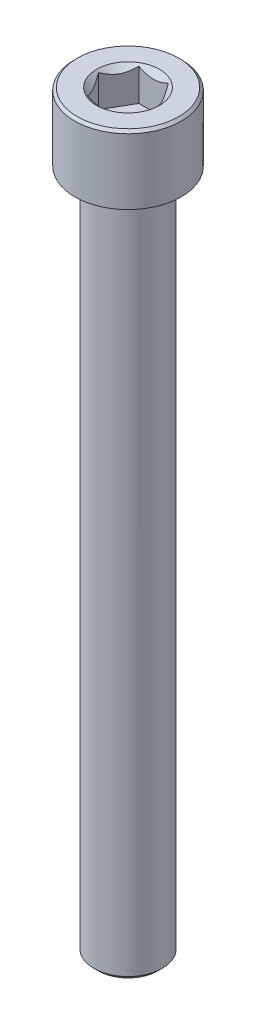
ISO-10303-21;
HEADER;
FILE_DESCRIPTION(('STEP AP214'),'2;1');
FILE_NAME('part.step','',(''),(''),'','','');
FILE_SCHEMA(('AUTOMOTIVE_DESIGN { 1 0 10303 214 1 1 1 1 }'));
ENDSEC;
DATA;
#1=APPLICATION_CONTEXT('core data for automotive mechanical design processes');
#2=APPLICATION_PROTOCOL_DEFINITION('international standard','automotive_design',2000,#1);
#3=PRODUCT_CONTEXT('',#1,'mechanical');
#4=PRODUCT('Part','Part','',(#3));
#5=PRODUCT_RELATED_PRODUCT_CATEGORY('part','',(#4));
#6=PRODUCT_DEFINITION_FORMATION('','',#4);
#7=PRODUCT_DEFINITION_CONTEXT('part definition',#1,'design');
#8=PRODUCT_DEFINITION('design','',#6,#7);
#9=PRODUCT_DEFINITION_SHAPE('','',#8);
#10=(LENGTH_UNIT() NAMED_UNIT(*) SI_UNIT(.MILLI.,.METRE.));
#11=(NAMED_UNIT(*) PLANE_ANGLE_UNIT() SI_UNIT($,.RADIAN.));
#12=(NAMED_UNIT(*) SI_UNIT($,.STERADIAN.) SOLID_ANGLE_UNIT());
#13=UNCERTAINTY_MEASURE_WITH_UNIT(LENGTH_MEASURE(1.E-05),#10,'distance_accuracy_value','');
#14=(GEOMETRIC_REPRESENTATION_CONTEXT(3) GLOBAL_UNCERTAINTY_ASSIGNED_CONTEXT((#13)) GLOBAL_UNIT_ASSIGNED_CONTEXT((#10,
#11,#12)) REPRESENTATION_CONTEXT('',''));
#15=CARTESIAN_POINT('',(0.,0.,0.));
#16=DIRECTION('',(0.,0.,1.));
#17=DIRECTION('',(1.,0.,0.));
#18=AXIS2_PLACEMENT_3D('',#15,#16,#17);
#19=CARTESIAN_POINT('',(0.,0.,0.));
#20=DIRECTION('',(0.,1.,0.));
#21=DIRECTION('',(0.,0.,1.));
#22=AXIS2_PLACEMENT_3D('',#19,#20,#21);
#23=PLANE('',#22);
#24=CARTESIAN_POINT('',(0.,0.,0.));
#25=DIRECTION('',(0.,1.,0.));
#26=DIRECTION('',(0.,0.,1.));
#27=AXIS2_PLACEMENT_3D('',#24,#25,#26);
#28=CIRCLE('',#27,3.5);
#29=CARTESIAN_POINT('',(0.,0.,3.5));
#30=VERTEX_POINT('',#29);
#31=EDGE_CURVE('E43',#30,#30,#28,.F.);
#32=ORIENTED_EDGE('',*,*,#31,.T.);
#33=EDGE_LOOP('',(#32));
#34=FACE_BOUND('',#33,.T.);
#35=ADVANCED_FACE('F35',(#34),#23,.F.);
#36=CARTESIAN_POINT('',(0.,0.,0.));
#37=DIRECTION('',(0.,-1.,0.));
#38=DIRECTION('',(0.,0.,-1.));
#39=AXIS2_PLACEMENT_3D('',#36,#37,#38);
#40=CYLINDRICAL_SURFACE('',#39,4.);
#41=CARTESIAN_POINT('',(0.,0.499999999999997,0.));
#42=DIRECTION('',(0.,1.,0.));
#43=DIRECTION('',(0.,0.,1.));
#44=AXIS2_PLACEMENT_3D('',#41,#42,#43);
#45=CIRCLE('',#44,4.);
#46=CARTESIAN_POINT('',(0.,0.499999999999997,4.));
#47=VERTEX_POINT('',#46);
#48=EDGE_CURVE('E11',#47,#47,#45,.T.);
#49=ORIENTED_EDGE('',*,*,#48,.T.);
#50=EDGE_LOOP('',(#49));
#51=FACE_BOUND('',#50,.T.);
#52=CARTESIAN_POINT('',(0.,80.,0.));
#53=DIRECTION('',(0.,-1.,0.));
#54=DIRECTION('',(0.,0.,-1.));
#55=AXIS2_PLACEMENT_3D('',#52,#53,#54);
#56=CIRCLE('',#55,4.);
#57=CARTESIAN_POINT('',(0.,80.,-4.));
#58=VERTEX_POINT('',#57);
#59=EDGE_CURVE('E120',#58,#58,#56,.T.);
#60=ORIENTED_EDGE('',*,*,#59,.T.);
#61=EDGE_LOOP('',(#60));
#62=FACE_BOUND('',#61,.T.);
#63=ADVANCED_FACE('F191',(#51,#62),#40,.T.);
#64=CARTESIAN_POINT('',(-4.,80.,0.));
#65=DIRECTION('',(0.,1.,0.));
#66=DIRECTION('',(0.,0.,1.));
#67=AXIS2_PLACEMENT_3D('',#64,#65,#66);
#68=PLANE('',#67);
#69=ORIENTED_EDGE('',*,*,#59,.F.);
#70=EDGE_LOOP('',(#69));
#71=FACE_BOUND('',#70,.T.);
#72=CARTESIAN_POINT('',(0.,80.,0.));
#73=DIRECTION('',(0.,-1.,0.));
#74=DIRECTION('',(0.,0.,-1.));
#75=AXIS2_PLACEMENT_3D('',#72,#73,#74);
#76=CIRCLE('',#75,6.25);
#77=CARTESIAN_POINT('',(0.,80.,-6.25));
#78=VERTEX_POINT('',#77);
#79=EDGE_CURVE('E117',#78,#78,#76,.T.);
#80=ORIENTED_EDGE('',*,*,#79,.T.);
#81=EDGE_LOOP('',(#80));
#82=FACE_BOUND('',#81,.T.);
#83=ADVANCED_FACE('F197',(#71,#82),#68,.F.);
#84=CARTESIAN_POINT('',(0.,0.,0.));
#85=DIRECTION('',(0.,-1.,0.));
#86=DIRECTION('',(0.,0.,-1.));
#87=AXIS2_PLACEMENT_3D('',#84,#85,#86);
#88=CYLINDRICAL_SURFACE('',#87,6.25);
#89=CARTESIAN_POINT('',(0.,87.7,0.));
#90=DIRECTION('',(0.,-1.,0.));
#91=DIRECTION('',(0.,0.,-1.));
#92=AXIS2_PLACEMENT_3D('',#89,#90,#91);
#93=CIRCLE('',#92,6.25);
#94=CARTESIAN_POINT('',(0.,87.7,-6.25));
#95=VERTEX_POINT('',#94);
#96=EDGE_CURVE('E123',#95,#95,#93,.T.);
#97=ORIENTED_EDGE('',*,*,#96,.T.);
#98=EDGE_LOOP('',(#97));
#99=FACE_BOUND('',#98,.T.);
#100=ORIENTED_EDGE('',*,*,#79,.F.);
#101=EDGE_LOOP('',(#100));
#102=FACE_BOUND('',#101,.T.);
#103=ADVANCED_FACE('F208',(#99,#102),#88,.T.);
#104=CARTESIAN_POINT('',(-6.25,88.,0.));
#105=DIRECTION('',(0.,-1.,0.));
#106=DIRECTION('',(0.,0.,-1.));
#107=AXIS2_PLACEMENT_3D('',#104,#105,#106);
#108=PLANE('',#107);
#109=CARTESIAN_POINT('',(0.,88.,0.));
#110=DIRECTION('',(0.,1.,0.));
#111=DIRECTION('',(0.,0.,1.));
#112=AXIS2_PLACEMENT_3D('',#109,#110,#111);
#113=CIRCLE('',#112,3.68172134015619);
#114=CARTESIAN_POINT('',(0.,88.,3.68172134015619));
#115=VERTEX_POINT('',#114);
#116=EDGE_CURVE('E338',#115,#115,#113,.T.);
#117=ORIENTED_EDGE('',*,*,#116,.F.);
#118=EDGE_LOOP('',(#117));
#119=FACE_BOUND('',#118,.T.);
#120=CARTESIAN_POINT('',(0.,88.,0.));
#121=DIRECTION('',(0.,-1.,0.));
#122=DIRECTION('',(0.,0.,-1.));
#123=AXIS2_PLACEMENT_3D('',#120,#121,#122);
#124=CIRCLE('',#123,5.95000000000002);
#125=CARTESIAN_POINT('',(0.,88.,-5.95000000000002));
#126=VERTEX_POINT('',#125);
#127=EDGE_CURVE('E94',#126,#126,#124,.F.);
#128=ORIENTED_EDGE('',*,*,#127,.T.);
#129=EDGE_LOOP('',(#128));
#130=FACE_BOUND('',#129,.T.);
#131=ADVANCED_FACE('F203',(#119,#130),#108,.F.);
#132=CARTESIAN_POINT('',(0.,87.7,0.));
#133=DIRECTION('',(0.,-1.,0.));
#134=DIRECTION('',(0.,0.,-1.));
#135=AXIS2_PLACEMENT_3D('',#132,#133,#134);
#136=CONICAL_SURFACE('',#135,6.25,0.785398163397451);
#137=ORIENTED_EDGE('',*,*,#127,.F.);
#138=EDGE_LOOP('',(#137));
#139=FACE_BOUND('',#138,.T.);
#140=ORIENTED_EDGE('',*,*,#96,.F.);
#141=EDGE_LOOP('',(#140));
#142=FACE_BOUND('',#141,.T.);
#143=ADVANCED_FACE('F139',(#139,#142),#136,.T.);
#144=CARTESIAN_POINT('',(0.,88.,0.));
#145=DIRECTION('',(0.,1.,0.));
#146=DIRECTION('',(0.,0.,1.));
#147=AXIS2_PLACEMENT_3D('',#144,#145,#146);
#148=CONICAL_SURFACE('',#147,3.68172134015619,0.785398163397449);
#149=ORIENTED_EDGE('',*,*,#116,.T.);
#150=EDGE_LOOP('',(#149));
#151=FACE_BOUND('',#150,.T.);
#152=CARTESIAN_POINT('',(-3.57414153717217,88.9845928078346,3.));
#153=CARTESIAN_POINT('',(-3.48763354421077,88.918347344031,3.));
#154=CARTESIAN_POINT('',(-3.40065485701271,88.8527068014046,3.));
#155=CARTESIAN_POINT('',(-3.22556536628367,88.7229105596247,3.));
#156=CARTESIAN_POINT('',(-3.13745429592208,88.6587552207989,3.));
#157=CARTESIAN_POINT('',(-2.95926502940819,88.5317477625692,3.));
#158=CARTESIAN_POINT('',(-2.86917689491204,88.4689095404859,3.));
#159=CARTESIAN_POINT('',(-2.68749351951163,88.3454583721269,3.));
#160=CARTESIAN_POINT('',(-2.5958983836401,88.2848452717117,3.));
#161=CARTESIAN_POINT('',(-2.40523426187287,88.1626856152111,3.));
#162=CARTESIAN_POINT('',(-2.30605328102177,88.1013129786067,3.));
#163=CARTESIAN_POINT('',(-2.105365061048,87.9824325210317,3.));
#164=CARTESIAN_POINT('',(-2.00385743987677,87.9249253409785,3.));
#165=CARTESIAN_POINT('',(-1.79849745550954,87.8150046063731,3.));
#166=CARTESIAN_POINT('',(-1.69465316441121,87.7625760890662,3.));
#167=CARTESIAN_POINT('',(-1.48405420683512,87.663987161909,3.));
#168=CARTESIAN_POINT('',(-1.37730092797841,87.6178238242345,3.));
#169=CARTESIAN_POINT('',(-1.17088222190216,87.5374103113695,3.));
#170=CARTESIAN_POINT('',(-1.07149734601239,87.5024473221765,3.));
#171=CARTESIAN_POINT('',(-0.870230144552076,87.4404802404136,3.));
#172=CARTESIAN_POINT('',(-0.768347657354247,87.4134766643998,3.));
#173=CARTESIAN_POINT('',(-0.564447624779061,87.3693266023403,3.));
#174=CARTESIAN_POINT('',(-0.462468933304163,87.3520036676269,3.));
#175=CARTESIAN_POINT('',(-0.257288650084501,87.3275703633682,3.));
#176=CARTESIAN_POINT('',(-0.154087304614485,87.3204579712627,3.));
#177=CARTESIAN_POINT('',(0.0481861337271449,87.3170323431804,3.));
#178=CARTESIAN_POINT('',(0.147250905244539,87.3202810238262,3.));
#179=CARTESIAN_POINT('',(0.344589076655326,87.3364014246806,3.));
#180=CARTESIAN_POINT('',(0.44286240247697,87.3492740352571,3.));
#181=CARTESIAN_POINT('',(0.639570667541516,87.3841396910622,3.));
#182=CARTESIAN_POINT('',(0.737976852204939,87.4062922789742,3.));
#183=CARTESIAN_POINT('',(0.932628435913935,87.4585009084323,3.));
#184=CARTESIAN_POINT('',(1.02887397223985,87.4885564463,3.));
#185=CARTESIAN_POINT('',(1.22532003458177,87.5574747225556,3.));
#186=CARTESIAN_POINT('',(1.32536043310459,87.5967888675383,3.));
#187=CARTESIAN_POINT('',(1.52284952412821,87.6814775662887,3.));
#188=CARTESIAN_POINT('',(1.62029736425405,87.7268540844093,3.));
#189=CARTESIAN_POINT('',(1.81308604298931,87.8225985437204,3.));
#190=CARTESIAN_POINT('',(1.90841896877327,87.8729822890255,3.));
#191=CARTESIAN_POINT('',(2.09689622819787,87.9776272778976,3.));
#192=CARTESIAN_POINT('',(2.19004094502825,88.031887835746,3.));
#193=CARTESIAN_POINT('',(2.369872611791,88.1407691556288,3.));
#194=CARTESIAN_POINT('',(2.45665114613525,88.1952394529636,3.));
#195=CARTESIAN_POINT('',(2.62871750489488,88.3064926464856,3.));
#196=CARTESIAN_POINT('',(2.71400521657294,88.3632757164947,3.));
#197=CARTESIAN_POINT('',(2.88259790064296,88.4782780272199,3.));
#198=CARTESIAN_POINT('',(2.96591330750259,88.5364820260229,3.));
#199=CARTESIAN_POINT('',(3.13140205426232,88.6544457904063,3.));
#200=CARTESIAN_POINT('',(3.21357570254097,88.7142051228644,3.));
#201=CARTESIAN_POINT('',(3.2952705817368,88.7746009335197,3.));
#202=B_SPLINE_CURVE_WITH_KNOTS('',3,(#152,#153,#154,#155,#156,#157,#158,#159,#160,#161,#162,
#163,#164,#165,#166,#167,#168,#169,#170,#171,#172,#173,#174,#175,#176,#177,#178,#179,#180,#181,
#182,#183,#184,#185,#186,#187,#188,#189,#190,#191,#192,#193,#194,#195,#196,#197,#198,#199,#200,
#201),.UNSPECIFIED.,.F.,.F.,(4,2,2,2,2,2,2,2,2,2,2,2,2,2,2,2,2,2,2,2,2,2,2,2,4),(0.,
0.326883534696343,0.653845561216819,0.983333574679485,1.31279872045119,1.66263039077582,
2.012519923068,2.36134508374108,2.71000666706381,3.02579926641578,3.34161235580212,
3.65146388205708,3.96125402275307,4.25812208285705,4.55501761141501,4.85724167639796,
5.15944648441816,5.48166266665303,5.80398350895796,6.12735610013868,6.45067163510516,
6.75800096012909,7.0653534259893,7.37023156667129,7.67502569597),.UNSPECIFIED.);
#203=CARTESIAN_POINT('',(-1.73205080756888,87.7823802749816,3.));
#204=VERTEX_POINT('',#203);
#205=CARTESIAN_POINT('',(1.73205080756888,87.7823802749816,3.));
#206=VERTEX_POINT('',#205);
#207=EDGE_CURVE('E101',#204,#206,#202,.T.);
#208=ORIENTED_EDGE('',*,*,#207,.F.);
#209=CARTESIAN_POINT('',(-3.46421708519159,87.7824957508087,-0.000199999999999535));
#210=CARTESIAN_POINT('',(-3.40467869607211,87.7230085933033,0.102923514955744));
#211=CARTESIAN_POINT('',(-3.34414474757781,87.6670152544471,0.207771389330644));
#212=CARTESIAN_POINT('',(-3.2207094063533,87.5644928713605,0.421567671781089));
#213=CARTESIAN_POINT('',(-3.15779627521276,87.5180208687229,0.530536411379754));
#214=CARTESIAN_POINT('',(-3.03093496880242,87.4384134634979,0.750266639597022));
#215=CARTESIAN_POINT('',(-2.96701910000607,87.4050779756242,0.860972171762204));
#216=CARTESIAN_POINT('',(-2.83778025907547,87.3537178189609,1.08482041056532));
#217=CARTESIAN_POINT('',(-2.7724612348602,87.3356548125172,1.19795627920698));
#218=CARTESIAN_POINT('',(-2.65988677911465,87.3193571834321,1.39294095619269));
#219=CARTESIAN_POINT('',(-2.61277673046431,87.3169446421554,1.47453795400212));
#220=CARTESIAN_POINT('',(-2.51863325954799,87.3210097096387,1.63759922883008));
#221=CARTESIAN_POINT('',(-2.47159986993094,87.3274904350099,1.71906344929898));
#222=CARTESIAN_POINT('',(-2.37797867687426,87.3489719974968,1.88122011233836));
#223=CARTESIAN_POINT('',(-2.3313914312269,87.3639823649488,1.96191158878429));
#224=CARTESIAN_POINT('',(-2.23901705721439,87.4017039210476,2.12190869789132));
#225=CARTESIAN_POINT('',(-2.1932298677905,87.4244145193044,2.20121443630928));
#226=CARTESIAN_POINT('',(-2.11194373930153,87.4711409598355,2.34200614080274));
#227=CARTESIAN_POINT('',(-2.07626488907773,87.4939286026624,2.40380372214602));
#228=CARTESIAN_POINT('',(-2.00554773988156,87.543176561039,2.52628941752021));
#229=CARTESIAN_POINT('',(-1.97050946049034,87.5696369886478,2.5869774976356));
#230=CARTESIAN_POINT('',(-1.90118383838356,87.6256372693729,2.70705299739086));
#231=CARTESIAN_POINT('',(-1.86689452386373,87.6551674394599,2.76644383229591));
#232=CARTESIAN_POINT('',(-1.79895094584795,87.7169193665571,2.88412556146727));
#233=CARTESIAN_POINT('',(-1.76529630793217,87.7491394716409,2.94241710424774));
#234=CARTESIAN_POINT('',(-1.73193533751504,87.7824957508087,3.0002));
#235=B_SPLINE_CURVE_WITH_KNOTS('',3,(#209,#210,#211,#212,#213,#214,#215,#216,#217,#218,#219,
#220,#221,#222,#223,#224,#225,#226,#227,#228,#229,#230,#231,#232,#233,#234),.UNSPECIFIED.,.F.,
.F.,(4,2,2,2,2,2,2,2,2,2,2,2,4),(0.,0.399603557139297,0.801535286397833,1.19708369162342,
1.59163620080172,1.87398941755843,2.15644160919091,2.43921001247423,2.72195674032136,
2.94657516661926,3.17120044767274,3.39513752837809,3.61893808380739),.UNSPECIFIED.);
#236=CARTESIAN_POINT('',(-3.46410161513775,87.7823802749816,0.));
#237=VERTEX_POINT('',#236);
#238=EDGE_CURVE('E159',#237,#204,#235,.T.);
#239=ORIENTED_EDGE('',*,*,#238,.F.);
#240=CARTESIAN_POINT('',(-1.73193533751504,87.7824957508087,-3.0002));
#241=CARTESIAN_POINT('',(-1.79147372663452,87.7230085933034,-2.89707648504425));
#242=CARTESIAN_POINT('',(-1.85200767512883,87.6670152544471,-2.79222861066935));
#243=CARTESIAN_POINT('',(-1.97544301635334,87.5644928713605,-2.5784323282189));
#244=CARTESIAN_POINT('',(-2.03835614749388,87.5180208687228,-2.46946358862024));
#245=CARTESIAN_POINT('',(-2.16521745390422,87.4384134634979,-2.24973336040297));
#246=CARTESIAN_POINT('',(-2.22913332270057,87.4050779756242,-2.13902782823779));
#247=CARTESIAN_POINT('',(-2.35837216363117,87.3537178189609,-1.91517958943468));
#248=CARTESIAN_POINT('',(-2.42369118784644,87.3356548125172,-1.80204372079301));
#249=CARTESIAN_POINT('',(-2.53626564359199,87.3193571834321,-1.6070590438073));
#250=CARTESIAN_POINT('',(-2.58337569224233,87.3169446421554,-1.52546204599787));
#251=CARTESIAN_POINT('',(-2.67751916315865,87.3210097096387,-1.36240077116991));
#252=CARTESIAN_POINT('',(-2.72455255277569,87.3274904350099,-1.28093655070102));
#253=CARTESIAN_POINT('',(-2.81817374583237,87.3489719974968,-1.11877988766163));
#254=CARTESIAN_POINT('',(-2.86476099147974,87.3639823649488,-1.0380884112157));
#255=CARTESIAN_POINT('',(-2.95713536549225,87.4017039210476,-0.87809130210867));
#256=CARTESIAN_POINT('',(-3.00292255491614,87.4244145193044,-0.798785563690709));
#257=CARTESIAN_POINT('',(-3.0842086834051,87.4711409598355,-0.657993859197251));
#258=CARTESIAN_POINT('',(-3.11988753362891,87.4939286026624,-0.596196277853977));
#259=CARTESIAN_POINT('',(-3.19060468282508,87.543176561039,-0.473710582479782));
#260=CARTESIAN_POINT('',(-3.2256429622163,87.5696369886478,-0.413022502364399));
#261=CARTESIAN_POINT('',(-3.29496858432307,87.6256372693729,-0.29294700260914));
#262=CARTESIAN_POINT('',(-3.32925789884291,87.6551674394599,-0.233556167704084));
#263=CARTESIAN_POINT('',(-3.39720147685869,87.7169193665571,-0.115874438532732));
#264=CARTESIAN_POINT('',(-3.43085611477447,87.7491394716409,-0.0575828957522648));
#265=CARTESIAN_POINT('',(-3.46421708519159,87.7824957508087,0.000199999999999888));
#266=B_SPLINE_CURVE_WITH_KNOTS('',3,(#240,#241,#242,#243,#244,#245,#246,#247,#248,#249,#250,
#251,#252,#253,#254,#255,#256,#257,#258,#259,#260,#261,#262,#263,#264,#265),.UNSPECIFIED.,.F.,
.F.,(4,2,2,2,2,2,2,2,2,2,2,2,4),(0.,0.399603557139306,0.801535286397845,1.19708369162343,
1.59163620080172,1.87398941755844,2.15644160919092,2.43921001247424,2.72195674032137,
2.94657516661926,3.17120044767274,3.39513752837809,3.61893808380739),.UNSPECIFIED.);
#267=CARTESIAN_POINT('',(-1.73205080756888,87.7823802749816,-3.));
#268=VERTEX_POINT('',#267);
#269=EDGE_CURVE('E153',#268,#237,#266,.T.);
#270=ORIENTED_EDGE('',*,*,#269,.F.);
#271=CARTESIAN_POINT('',(-3.57414153716177,88.9845928078267,-3.));
#272=CARTESIAN_POINT('',(-3.48763354420066,88.9183473440233,-3.));
#273=CARTESIAN_POINT('',(-3.4006548570029,88.8527068013973,-3.));
#274=CARTESIAN_POINT('',(-3.22556536627446,88.7229105596179,-3.));
#275=CARTESIAN_POINT('',(-3.13745429591317,88.6587552207925,-3.));
#276=CARTESIAN_POINT('',(-2.95926502939989,88.5317477625634,-3.));
#277=CARTESIAN_POINT('',(-2.86917689490405,88.4689095404803,-3.));
#278=CARTESIAN_POINT('',(-2.68749351950428,88.345458372122,-3.));
#279=CARTESIAN_POINT('',(-2.59589838363306,88.2848452717071,-3.));
#280=CARTESIAN_POINT('',(-2.40523426186653,88.1626856152071,-3.));
#281=CARTESIAN_POINT('',(-2.3060532810158,88.101312978603,-3.));
#282=CARTESIAN_POINT('',(-2.10536506104278,87.9824325210287,-3.));
#283=CARTESIAN_POINT('',(-2.00385743987193,87.9249253409758,-3.));
#284=CARTESIAN_POINT('',(-1.79849745550547,87.815004606371,-3.));
#285=CARTESIAN_POINT('',(-1.69465316440754,87.7625760890644,-3.));
#286=CARTESIAN_POINT('',(-1.48405420683225,87.6639871619078,-3.));
#287=CARTESIAN_POINT('',(-1.37730092797596,87.6178238242335,-3.));
#288=CARTESIAN_POINT('',(-1.17088222189989,87.5374103113687,-3.));
#289=CARTESIAN_POINT('',(-1.07149734600986,87.5024473221756,-3.));
#290=CARTESIAN_POINT('',(-0.870230144549019,87.4404802404128,-3.));
#291=CARTESIAN_POINT('',(-0.768347657350922,87.413476664399,-3.));
#292=CARTESIAN_POINT('',(-0.564447624775211,87.3693266023395,-3.));
#293=CARTESIAN_POINT('',(-0.462468933300055,87.3520036676262,-3.));
#294=CARTESIAN_POINT('',(-0.257288650079884,87.3275703633677,-3.));
#295=CARTESIAN_POINT('',(-0.154087304609616,87.3204579712624,-3.));
#296=CARTESIAN_POINT('',(0.0481861337324526,87.3170323431805,-3.));
#297=CARTESIAN_POINT('',(0.147250905250035,87.3202810238264,-3.));
#298=CARTESIAN_POINT('',(0.344589076661178,87.3364014246813,-3.));
#299=CARTESIAN_POINT('',(0.442862402482988,87.349274035258,-3.));
#300=CARTESIAN_POINT('',(0.639570667547867,87.3841396910636,-3.));
#301=CARTESIAN_POINT('',(0.737976852211455,87.4062922789758,-3.));
#302=CARTESIAN_POINT('',(0.932628435920758,87.4585009084343,-3.));
#303=CARTESIAN_POINT('',(1.02887397224682,87.4885564463023,-3.));
#304=CARTESIAN_POINT('',(1.22532003458954,87.5574747225585,-3.));
#305=CARTESIAN_POINT('',(1.32536043311302,87.5967888675417,-3.));
#306=CARTESIAN_POINT('',(1.52284952413791,87.6814775662931,-3.));
#307=CARTESIAN_POINT('',(1.62029736426438,87.7268540844142,-3.));
#308=CARTESIAN_POINT('',(1.81308604300086,87.8225985437264,-3.));
#309=CARTESIAN_POINT('',(1.90841896878542,87.872982289032,-3.));
#310=CARTESIAN_POINT('',(2.09689622821119,87.9776272779052,-3.));
#311=CARTESIAN_POINT('',(2.19004094504215,88.0318878357542,-3.));
#312=CARTESIAN_POINT('',(2.36987261180596,88.1407691556381,-3.));
#313=CARTESIAN_POINT('',(2.45665114615069,88.1952394529734,-3.));
#314=CARTESIAN_POINT('',(2.62871750491126,88.3064926464964,-3.));
#315=CARTESIAN_POINT('',(2.71400521658978,88.363275716506,-3.));
#316=CARTESIAN_POINT('',(2.88259790066073,88.4782780272322,-3.));
#317=CARTESIAN_POINT('',(2.96591330752082,88.5364820260357,-3.));
#318=CARTESIAN_POINT('',(3.13140205428145,88.6544457904201,-3.));
#319=CARTESIAN_POINT('',(3.21357570256055,88.7142051228787,-3.));
#320=CARTESIAN_POINT('',(3.29527058175683,88.7746009335345,-3.));
#321=B_SPLINE_CURVE_WITH_KNOTS('',3,(#271,#272,#273,#274,#275,#276,#277,#278,#279,#280,#281,
#282,#283,#284,#285,#286,#287,#288,#289,#290,#291,#292,#293,#294,#295,#296,#297,#298,#299,#300,
#301,#302,#303,#304,#305,#306,#307,#308,#309,#310,#311,#312,#313,#314,#315,#316,#317,#318,#319,
#320),.UNSPECIFIED.,.F.,.F.,(4,2,2,2,2,2,2,2,2,2,2,2,2,2,2,2,2,2,2,2,2,2,2,2,4),(0.,
0.326883534695068,0.653845561214274,0.983333574675654,1.31279872044605,1.66263039076922,
2.01251992305993,2.36134508373158,2.71000666705287,3.0257992664056,3.34161235579268,
3.65146388204836,3.96125402274507,4.25812208284963,4.55501761140817,4.85724167639175,
5.15944648441258,5.48166266664978,5.80398350895705,6.12735610014013,6.45067163510897,
6.75800096013493,7.06535342599714,7.3702315666811,7.67502569598179),.UNSPECIFIED.);
#322=CARTESIAN_POINT('',(1.73205080756888,87.7823802749816,-3.));
#323=VERTEX_POINT('',#322);
#324=EDGE_CURVE('E50',#323,#268,#321,.F.);
#325=ORIENTED_EDGE('',*,*,#324,.F.);
#326=CARTESIAN_POINT('',(3.46421708519159,87.7824957508087,0.000199999999998427));
#327=CARTESIAN_POINT('',(3.40467869607211,87.7230085933034,-0.102923514955751));
#328=CARTESIAN_POINT('',(3.3441447475778,87.6670152544471,-0.207771389330653));
#329=CARTESIAN_POINT('',(3.22070940635329,87.5644928713605,-0.421567671781099));
#330=CARTESIAN_POINT('',(3.15779627521275,87.5180208687228,-0.530536411379763));
#331=CARTESIAN_POINT('',(3.03093496880241,87.4384134634979,-0.750266639597031));
#332=CARTESIAN_POINT('',(2.96701910000606,87.4050779756242,-0.860972171762213));
#333=CARTESIAN_POINT('',(2.83778025907546,87.3537178189609,-1.08482041056532));
#334=CARTESIAN_POINT('',(2.7724612348602,87.3356548125172,-1.19795627920699));
#335=CARTESIAN_POINT('',(2.65988677911464,87.3193571834321,-1.3929409561927));
#336=CARTESIAN_POINT('',(2.6127767304643,87.3169446421554,-1.47453795400213));
#337=CARTESIAN_POINT('',(2.51863325954798,87.3210097096387,-1.63759922883009));
#338=CARTESIAN_POINT('',(2.47159986993094,87.3274904350099,-1.71906344929899));
#339=CARTESIAN_POINT('',(2.37797867687426,87.3489719974968,-1.88122011233837));
#340=CARTESIAN_POINT('',(2.33139143122689,87.3639823649488,-1.9619115887843));
#341=CARTESIAN_POINT('',(2.23901705721439,87.4017039210476,-2.12190869789133));
#342=CARTESIAN_POINT('',(2.19322986779049,87.4244145193044,-2.20121443630929));
#343=CARTESIAN_POINT('',(2.11194373930153,87.4711409598355,-2.34200614080275));
#344=CARTESIAN_POINT('',(2.07626488907772,87.4939286026624,-2.40380372214602));
#345=CARTESIAN_POINT('',(2.00554773988155,87.543176561039,-2.52628941752022));
#346=CARTESIAN_POINT('',(1.97050946049033,87.5696369886478,-2.5869774976356));
#347=CARTESIAN_POINT('',(1.90118383838356,87.6256372693729,-2.70705299739086));
#348=CARTESIAN_POINT('',(1.86689452386373,87.6551674394599,-2.76644383229592));
#349=CARTESIAN_POINT('',(1.79895094584795,87.7169193665571,-2.88412556146727));
#350=CARTESIAN_POINT('',(1.76529630793217,87.7491394716409,-2.94241710424773));
#351=CARTESIAN_POINT('',(1.73193533751504,87.7824957508087,-3.0002));
#352=B_SPLINE_CURVE_WITH_KNOTS('',3,(#326,#327,#328,#329,#330,#331,#332,#333,#334,#335,#336,
#337,#338,#339,#340,#341,#342,#343,#344,#345,#346,#347,#348,#349,#350,#351),.UNSPECIFIED.,.F.,
.F.,(4,2,2,2,2,2,2,2,2,2,2,2,4),(0.,0.399603557139308,0.801535286397849,1.19708369162343,
1.59163620080173,1.87398941755844,2.15644160919092,2.43921001247425,2.72195674032138,
2.94657516661926,3.17120044767274,3.39513752837809,3.61893808380739),.UNSPECIFIED.);
#353=CARTESIAN_POINT('',(3.46410161513775,87.7823802749816,0.));
#354=VERTEX_POINT('',#353);
#355=EDGE_CURVE('E87',#354,#323,#352,.T.);
#356=ORIENTED_EDGE('',*,*,#355,.F.);
#357=CARTESIAN_POINT('',(1.73193533751504,87.7824957508087,3.0002));
#358=CARTESIAN_POINT('',(1.79147372663452,87.7230085933033,2.89707648504426));
#359=CARTESIAN_POINT('',(1.85200767512883,87.6670152544471,2.79222861066936));
#360=CARTESIAN_POINT('',(1.97544301635333,87.5644928713605,2.57843232821891));
#361=CARTESIAN_POINT('',(2.03835614749388,87.5180208687229,2.46946358862025));
#362=CARTESIAN_POINT('',(2.16521745390421,87.4384134634979,2.24973336040298));
#363=CARTESIAN_POINT('',(2.22913332270056,87.4050779756242,2.1390278282378));
#364=CARTESIAN_POINT('',(2.35837216363116,87.3537178189609,1.91517958943468));
#365=CARTESIAN_POINT('',(2.42369118784643,87.3356548125172,1.80204372079302));
#366=CARTESIAN_POINT('',(2.53626564359198,87.3193571834321,1.60705904380731));
#367=CARTESIAN_POINT('',(2.58337569224232,87.3169446421554,1.52546204599788));
#368=CARTESIAN_POINT('',(2.67751916315865,87.3210097096387,1.36240077116992));
#369=CARTESIAN_POINT('',(2.72455255277569,87.3274904350099,1.28093655070102));
#370=CARTESIAN_POINT('',(2.81817374583237,87.3489719974968,1.11877988766164));
#371=CARTESIAN_POINT('',(2.86476099147973,87.3639823649488,1.03808841121571));
#372=CARTESIAN_POINT('',(2.95713536549224,87.4017039210476,0.878091302108675));
#373=CARTESIAN_POINT('',(3.00292255491613,87.4244145193044,0.798785563690715));
#374=CARTESIAN_POINT('',(3.0842086834051,87.4711409598355,0.657993859197257));
#375=CARTESIAN_POINT('',(3.1198875336289,87.4939286026624,0.596196277853983));
#376=CARTESIAN_POINT('',(3.19060468282508,87.543176561039,0.473710582479787));
#377=CARTESIAN_POINT('',(3.22564296221629,87.5696369886478,0.413022502364402));
#378=CARTESIAN_POINT('',(3.29496858432307,87.6256372693729,0.292947002609142));
#379=CARTESIAN_POINT('',(3.3292578988429,87.6551674394599,0.233556167704086));
#380=CARTESIAN_POINT('',(3.39720147685868,87.7169193665571,0.115874438532734));
#381=CARTESIAN_POINT('',(3.43085611477446,87.7491394716409,0.0575828957522661));
#382=CARTESIAN_POINT('',(3.46421708519159,87.7824957508087,-0.000199999999998981));
#383=B_SPLINE_CURVE_WITH_KNOTS('',3,(#357,#358,#359,#360,#361,#362,#363,#364,#365,#366,#367,
#368,#369,#370,#371,#372,#373,#374,#375,#376,#377,#378,#379,#380,#381,#382),.UNSPECIFIED.,.F.,
.F.,(4,2,2,2,2,2,2,2,2,2,2,2,4),(0.,0.399603557139297,0.801535286397834,1.19708369162342,
1.59163620080172,1.87398941755843,2.15644160919092,2.43921001247424,2.72195674032136,
2.94657516661926,3.17120044767274,3.39513752837809,3.61893808380739),.UNSPECIFIED.);
#384=EDGE_CURVE('E90',#206,#354,#383,.T.);
#385=ORIENTED_EDGE('',*,*,#384,.F.);
#386=EDGE_LOOP('',(#208,#239,#270,#325,#356,#385));
#387=FACE_BOUND('',#386,.T.);
#388=ADVANCED_FACE('F89',(#151,#387),#148,.F.);
#389=CARTESIAN_POINT('',(3.46410161513775,84.,0.));
#390=DIRECTION('',(0.,1.,0.));
#391=DIRECTION('',(0.,0.,1.));
#392=AXIS2_PLACEMENT_3D('',#389,#390,#391);
#393=PLANE('',#392);
#394=DIRECTION('',(0.5,0.,-0.866025403784439));
#395=VECTOR('',#394,1.);
#396=CARTESIAN_POINT('',(1.73205080756888,84.,3.));
#397=LINE('',#396,#395);
#398=CARTESIAN_POINT('',(1.73205080756888,84.,3.));
#399=VERTEX_POINT('',#398);
#400=CARTESIAN_POINT('',(3.46410161513775,84.,0.));
#401=VERTEX_POINT('',#400);
#402=EDGE_CURVE('E100',#399,#401,#397,.T.);
#403=ORIENTED_EDGE('',*,*,#402,.T.);
#404=DIRECTION('',(-0.5,0.,-0.866025403784438));
#405=VECTOR('',#404,1.);
#406=CARTESIAN_POINT('',(3.46410161513775,84.,0.));
#407=LINE('',#406,#405);
#408=CARTESIAN_POINT('',(1.73205080756888,84.,-3.));
#409=VERTEX_POINT('',#408);
#410=EDGE_CURVE('E105',#401,#409,#407,.T.);
#411=ORIENTED_EDGE('',*,*,#410,.T.);
#412=DIRECTION('',(-1.,0.,0.));
#413=VECTOR('',#412,1.);
#414=CARTESIAN_POINT('',(1.73205080756888,84.,-3.));
#415=LINE('',#414,#413);
#416=CARTESIAN_POINT('',(-1.73205080756888,84.,-3.));
#417=VERTEX_POINT('',#416);
#418=EDGE_CURVE('E320',#409,#417,#415,.T.);
#419=ORIENTED_EDGE('',*,*,#418,.T.);
#420=DIRECTION('',(-0.5,0.,0.866025403784439));
#421=VECTOR('',#420,1.);
#422=CARTESIAN_POINT('',(-1.73205080756888,84.,-3.));
#423=LINE('',#422,#421);
#424=CARTESIAN_POINT('',(-3.46410161513776,84.,0.));
#425=VERTEX_POINT('',#424);
#426=EDGE_CURVE('E324',#417,#425,#423,.T.);
#427=ORIENTED_EDGE('',*,*,#426,.T.);
#428=DIRECTION('',(0.5,0.,0.866025403784439));
#429=VECTOR('',#428,1.);
#430=CARTESIAN_POINT('',(-3.46410161513776,84.,0.));
#431=LINE('',#430,#429);
#432=CARTESIAN_POINT('',(-1.73205080756888,84.,3.));
#433=VERTEX_POINT('',#432);
#434=EDGE_CURVE('E113',#425,#433,#431,.T.);
#435=ORIENTED_EDGE('',*,*,#434,.T.);
#436=DIRECTION('',(1.,0.,0.));
#437=VECTOR('',#436,1.);
#438=CARTESIAN_POINT('',(-1.73205080756888,84.,3.));
#439=LINE('',#438,#437);
#440=EDGE_CURVE('E108',#433,#399,#439,.T.);
#441=ORIENTED_EDGE('',*,*,#440,.T.);
#442=EDGE_LOOP('',(#403,#411,#419,#427,#435,#441));
#443=FACE_BOUND('',#442,.T.);
#444=ADVANCED_FACE('F138',(#443),#393,.T.);
#445=CARTESIAN_POINT('',(3.46410161513775,84.,0.));
#446=DIRECTION('',(0.866025403784439,0.,-0.5));
#447=DIRECTION('',(-0.5,0.,-0.866025403784438));
#448=AXIS2_PLACEMENT_3D('',#445,#446,#447);
#449=PLANE('',#448);
#450=DIRECTION('',(0.,1.,0.));
#451=VECTOR('',#450,1.);
#452=CARTESIAN_POINT('',(3.46410161513775,84.,0.));
#453=LINE('',#452,#451);
#454=EDGE_CURVE('E98',#401,#354,#453,.T.);
#455=ORIENTED_EDGE('',*,*,#454,.T.);
#456=ORIENTED_EDGE('',*,*,#355,.T.);
#457=DIRECTION('',(0.,1.,0.));
#458=VECTOR('',#457,1.);
#459=CARTESIAN_POINT('',(1.73205080756888,84.,-3.));
#460=LINE('',#459,#458);
#461=EDGE_CURVE('E107',#409,#323,#460,.T.);
#462=ORIENTED_EDGE('',*,*,#461,.F.);
#463=ORIENTED_EDGE('',*,*,#410,.F.);
#464=EDGE_LOOP('',(#455,#456,#462,#463));
#465=FACE_BOUND('',#464,.T.);
#466=ADVANCED_FACE('F103',(#465),#449,.F.);
#467=CARTESIAN_POINT('',(1.73205080756888,84.,-3.));
#468=DIRECTION('',(0.,0.,-1.));
#469=DIRECTION('',(-1.,0.,0.));
#470=AXIS2_PLACEMENT_3D('',#467,#468,#469);
#471=PLANE('',#470);
#472=ORIENTED_EDGE('',*,*,#461,.T.);
#473=ORIENTED_EDGE('',*,*,#324,.T.);
#474=DIRECTION('',(0.,1.,0.));
#475=VECTOR('',#474,1.);
#476=CARTESIAN_POINT('',(-1.73205080756888,84.,-3.));
#477=LINE('',#476,#475);
#478=EDGE_CURVE('E110',#417,#268,#477,.T.);
#479=ORIENTED_EDGE('',*,*,#478,.F.);
#480=ORIENTED_EDGE('',*,*,#418,.F.);
#481=EDGE_LOOP('',(#472,#473,#479,#480));
#482=FACE_BOUND('',#481,.T.);
#483=ADVANCED_FACE('F182',(#482),#471,.F.);
#484=CARTESIAN_POINT('',(-1.73205080756888,84.,-3.));
#485=DIRECTION('',(-0.866025403784439,0.,-0.5));
#486=DIRECTION('',(-0.5,0.,0.866025403784439));
#487=AXIS2_PLACEMENT_3D('',#484,#485,#486);
#488=PLANE('',#487);
#489=ORIENTED_EDGE('',*,*,#478,.T.);
#490=ORIENTED_EDGE('',*,*,#269,.T.);
#491=DIRECTION('',(0.,1.,0.));
#492=VECTOR('',#491,1.);
#493=CARTESIAN_POINT('',(-3.46410161513776,84.,0.));
#494=LINE('',#493,#492);
#495=EDGE_CURVE('E332',#425,#237,#494,.T.);
#496=ORIENTED_EDGE('',*,*,#495,.F.);
#497=ORIENTED_EDGE('',*,*,#426,.F.);
#498=EDGE_LOOP('',(#489,#490,#496,#497));
#499=FACE_BOUND('',#498,.T.);
#500=ADVANCED_FACE('F178',(#499),#488,.F.);
#501=CARTESIAN_POINT('',(-3.46410161513776,84.,0.));
#502=DIRECTION('',(-0.866025403784439,0.,0.5));
#503=DIRECTION('',(0.5,0.,0.866025403784439));
#504=AXIS2_PLACEMENT_3D('',#501,#502,#503);
#505=PLANE('',#504);
#506=ORIENTED_EDGE('',*,*,#495,.T.);
#507=ORIENTED_EDGE('',*,*,#238,.T.);
#508=DIRECTION('',(0.,1.,0.));
#509=VECTOR('',#508,1.);
#510=CARTESIAN_POINT('',(-1.73205080756888,84.,3.));
#511=LINE('',#510,#509);
#512=EDGE_CURVE('E329',#433,#204,#511,.T.);
#513=ORIENTED_EDGE('',*,*,#512,.F.);
#514=ORIENTED_EDGE('',*,*,#434,.F.);
#515=EDGE_LOOP('',(#506,#507,#513,#514));
#516=FACE_BOUND('',#515,.T.);
#517=ADVANCED_FACE('F175',(#516),#505,.F.);
#518=CARTESIAN_POINT('',(-1.73205080756888,84.,3.));
#519=DIRECTION('',(0.,0.,1.));
#520=DIRECTION('',(1.,0.,0.));
#521=AXIS2_PLACEMENT_3D('',#518,#519,#520);
#522=PLANE('',#521);
#523=ORIENTED_EDGE('',*,*,#512,.T.);
#524=ORIENTED_EDGE('',*,*,#207,.T.);
#525=DIRECTION('',(0.,1.,0.));
#526=VECTOR('',#525,1.);
#527=CARTESIAN_POINT('',(1.73205080756888,84.,3.));
#528=LINE('',#527,#526);
#529=EDGE_CURVE('E58',#399,#206,#528,.T.);
#530=ORIENTED_EDGE('',*,*,#529,.F.);
#531=ORIENTED_EDGE('',*,*,#440,.F.);
#532=EDGE_LOOP('',(#523,#524,#530,#531));
#533=FACE_BOUND('',#532,.T.);
#534=ADVANCED_FACE('F172',(#533),#522,.F.);
#535=CARTESIAN_POINT('',(1.73205080756888,84.,3.));
#536=DIRECTION('',(0.866025403784439,0.,0.5));
#537=DIRECTION('',(0.5,0.,-0.866025403784439));
#538=AXIS2_PLACEMENT_3D('',#535,#536,#537);
#539=PLANE('',#538);
#540=ORIENTED_EDGE('',*,*,#529,.T.);
#541=ORIENTED_EDGE('',*,*,#384,.T.);
#542=ORIENTED_EDGE('',*,*,#454,.F.);
#543=ORIENTED_EDGE('',*,*,#402,.F.);
#544=EDGE_LOOP('',(#540,#541,#542,#543));
#545=FACE_BOUND('',#544,.T.);
#546=ADVANCED_FACE('F97',(#545),#539,.F.);
#547=CARTESIAN_POINT('',(0.,0.,0.));
#548=DIRECTION('',(0.,1.,0.));
#549=DIRECTION('',(0.,0.,1.));
#550=AXIS2_PLACEMENT_3D('',#547,#548,#549);
#551=CONICAL_SURFACE('',#550,3.5,0.785398163397448);
#552=ORIENTED_EDGE('',*,*,#48,.F.);
#553=EDGE_LOOP('',(#552));
#554=FACE_BOUND('',#553,.T.);
#555=ORIENTED_EDGE('',*,*,#31,.F.);
#556=EDGE_LOOP('',(#555));
#557=FACE_BOUND('',#556,.T.);
#558=ADVANCED_FACE('F37',(#554,#557),#551,.T.);
#559=CLOSED_SHELL('',(#35,#63,#83,#103,#131,#143,#388,#444,#466,#483,#500,#517,#534,#546,#558));
#560=MANIFOLD_SOLID_BREP('B2',#559);
#561=ADVANCED_BREP_SHAPE_REPRESENTATION('',(#18,#560),#14);
#562=SHAPE_DEFINITION_REPRESENTATION(#9,#561);
ENDSEC;
END-ISO-10303-21;
